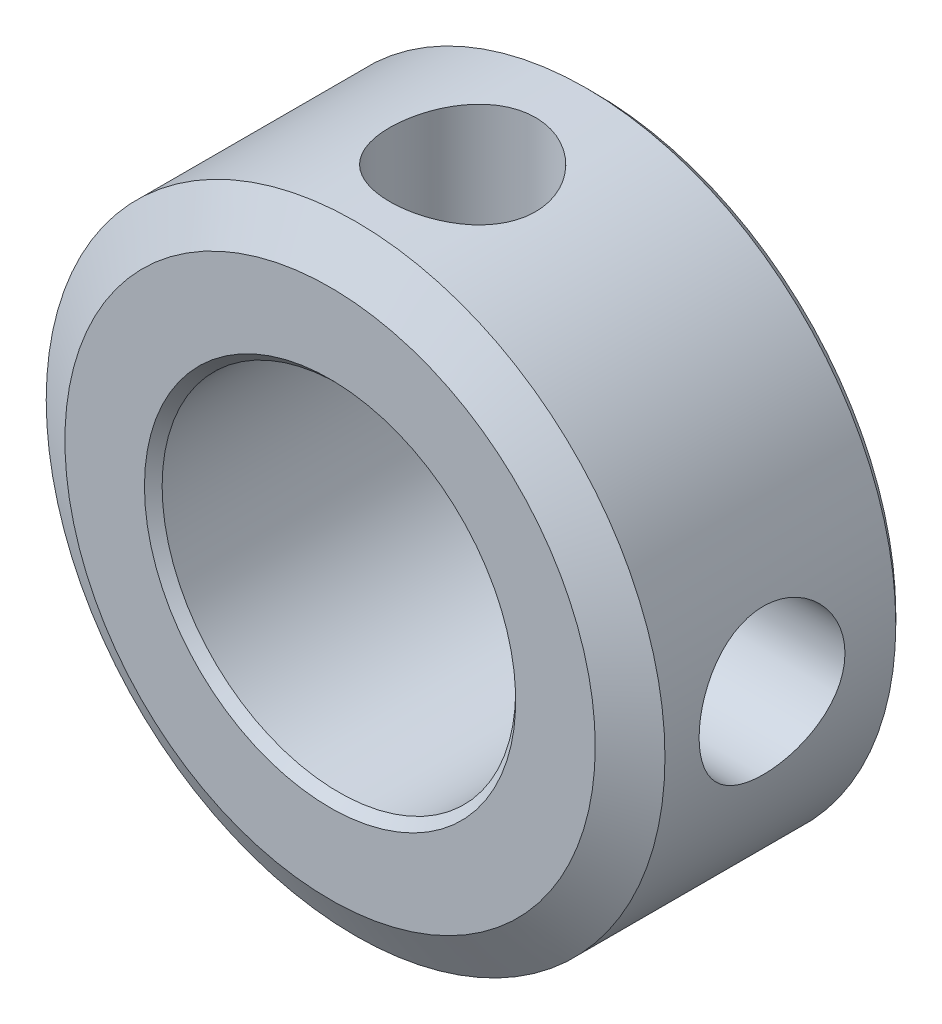
ISO-10303-21;
HEADER;
FILE_DESCRIPTION(('STEP AP214'),'2;1');
FILE_NAME('part.step','',(''),(''),'','','');
FILE_SCHEMA(('AUTOMOTIVE_DESIGN { 1 0 10303 214 1 1 1 1 }'));
ENDSEC;
DATA;
#1=APPLICATION_CONTEXT('core data for automotive mechanical design processes');
#2=APPLICATION_PROTOCOL_DEFINITION('international standard','automotive_design',2000,#1);
#3=PRODUCT_CONTEXT('',#1,'mechanical');
#4=PRODUCT('Part','Part','',(#3));
#5=PRODUCT_RELATED_PRODUCT_CATEGORY('part','',(#4));
#6=PRODUCT_DEFINITION_FORMATION('','',#4);
#7=PRODUCT_DEFINITION_CONTEXT('part definition',#1,'design');
#8=PRODUCT_DEFINITION('design','',#6,#7);
#9=PRODUCT_DEFINITION_SHAPE('','',#8);
#10=(LENGTH_UNIT() NAMED_UNIT(*) SI_UNIT(.MILLI.,.METRE.));
#11=(NAMED_UNIT(*) PLANE_ANGLE_UNIT() SI_UNIT($,.RADIAN.));
#12=(NAMED_UNIT(*) SI_UNIT($,.STERADIAN.) SOLID_ANGLE_UNIT());
#13=UNCERTAINTY_MEASURE_WITH_UNIT(LENGTH_MEASURE(1.E-05),#10,'distance_accuracy_value','');
#14=(GEOMETRIC_REPRESENTATION_CONTEXT(3) GLOBAL_UNCERTAINTY_ASSIGNED_CONTEXT((#13)) GLOBAL_UNIT_ASSIGNED_CONTEXT((#10,
#11,#12)) REPRESENTATION_CONTEXT('',''));
#15=CARTESIAN_POINT('',(0.,0.,0.));
#16=DIRECTION('',(0.,0.,1.));
#17=DIRECTION('',(1.,0.,0.));
#18=AXIS2_PLACEMENT_3D('',#15,#16,#17);
#19=CARTESIAN_POINT('',(0.,0.,0.));
#20=DIRECTION('',(0.,0.,1.));
#21=DIRECTION('',(1.,0.,0.));
#22=AXIS2_PLACEMENT_3D('',#19,#20,#21);
#23=CYLINDRICAL_SURFACE('',#22,7.);
#24=CARTESIAN_POINT('',(0.,7.,-1.35));
#25=CARTESIAN_POINT('',(-0.0913287393176134,6.99999836647252,-1.35000284387908));
#26=CARTESIAN_POINT('',(-0.182690417283303,6.99819467849873,-1.35760823084936));
#27=CARTESIAN_POINT('',(-0.362806323664361,6.9911739036526,-1.38778990146952));
#28=CARTESIAN_POINT('',(-0.451558855012934,6.98595464436713,-1.41037571327476));
#29=CARTESIAN_POINT('',(-0.623828476855957,6.97268218331077,-1.46976177401747));
#30=CARTESIAN_POINT('',(-0.707351348819676,6.96463217854926,-1.50654599200703));
#31=CARTESIAN_POINT('',(-0.867039208328408,6.9465609541058,-1.59323084871535));
#32=CARTESIAN_POINT('',(-0.943204151262114,6.93653972247338,-1.64313156695295));
#33=CARTESIAN_POINT('',(-1.0874214344422,6.91541181493805,-1.75560682165226));
#34=CARTESIAN_POINT('',(-1.15531854158778,6.90428991213628,-1.81837755355526));
#35=CARTESIAN_POINT('',(-1.27972508274131,6.88231817514457,-1.95439040917328));
#36=CARTESIAN_POINT('',(-1.33623336463363,6.87146836857753,-2.02763359102173));
#37=CARTESIAN_POINT('',(-1.43696684618771,6.85111743990827,-2.18369036745603));
#38=CARTESIAN_POINT('',(-1.48102236520305,6.84163573776828,-2.26661625042341));
#39=CARTESIAN_POINT('',(-1.5545098915109,6.8253150534534,-2.43895572170212));
#40=CARTESIAN_POINT('',(-1.58394395433771,6.81847569983819,-2.52836839605152));
#41=CARTESIAN_POINT('',(-1.62683125284546,6.80836995693017,-2.70944697203098));
#42=CARTESIAN_POINT('',(-1.64056162843084,6.80504168835829,-2.80104370422439));
#43=CARTESIAN_POINT('',(-1.65251435457551,6.80214944752779,-2.98529635366412));
#44=CARTESIAN_POINT('',(-1.65073893306961,6.80258493447765,-3.07795211683404));
#45=CARTESIAN_POINT('',(-1.63195247769315,6.80711518628286,-3.25959918079586));
#46=CARTESIAN_POINT('',(-1.61526770664355,6.81113158544196,-3.34862647996333));
#47=CARTESIAN_POINT('',(-1.56765494743684,6.82224669705885,-3.52258151951258));
#48=CARTESIAN_POINT('',(-1.53672604569693,6.82934560721949,-3.60750899655601));
#49=CARTESIAN_POINT('',(-1.46121486998613,6.84590028619908,-3.77174839705262));
#50=CARTESIAN_POINT('',(-1.41651088097455,6.85537691977426,-3.85100216939652));
#51=CARTESIAN_POINT('',(-1.31480384080152,6.87560701771075,-4.00100212094789));
#52=CARTESIAN_POINT('',(-1.25779885989579,6.88636068228985,-4.07174696258371));
#53=CARTESIAN_POINT('',(-1.13140044923306,6.90826612497408,-4.20459479769649));
#54=CARTESIAN_POINT('',(-1.06173067039408,6.91942110106382,-4.26643462795397));
#55=CARTESIAN_POINT('',(-0.912878848692461,6.940626418642,-4.37759964700094));
#56=CARTESIAN_POINT('',(-0.833696575268992,6.95067673334471,-4.42692453236693));
#57=CARTESIAN_POINT('',(-0.667717693598603,6.9685816950737,-4.51174102347949));
#58=CARTESIAN_POINT('',(-0.580900533100763,6.97643016161576,-4.54719379867907));
#59=CARTESIAN_POINT('',(-0.402313719817368,6.98900179511064,-4.60293155343658));
#60=CARTESIAN_POINT('',(-0.310544909289168,6.99372549177409,-4.62321910387752));
#61=CARTESIAN_POINT('',(-0.12691319889921,6.9994383716222,-4.64765768433283));
#62=CARTESIAN_POINT('',(-0.0351005767602219,7.00051059686152,-4.65216759669872));
#63=CARTESIAN_POINT('',(0.147966685501656,6.99903444009398,-4.64590172363087));
#64=CARTESIAN_POINT('',(0.239221369368363,6.99648634568227,-4.63512715238378));
#65=CARTESIAN_POINT('',(0.417362653019771,6.98810869992012,-4.59889492076259));
#66=CARTESIAN_POINT('',(0.504290552421104,6.98232213187254,-4.57362948647569));
#67=CARTESIAN_POINT('',(0.672672276070121,6.96811723407212,-4.50934934912358));
#68=CARTESIAN_POINT('',(0.754125584648711,6.9596986568229,-4.47033335300439));
#69=CARTESIAN_POINT('',(0.910700498955397,6.94096161251794,-4.37893957791364));
#70=CARTESIAN_POINT('',(0.985698570997652,6.93061465221504,-4.32635613942399));
#71=CARTESIAN_POINT('',(1.1259344495591,6.90921937825115,-4.20958668075749));
#72=CARTESIAN_POINT('',(1.19117076625592,6.89817095790026,-4.14539889283892));
#73=CARTESIAN_POINT('',(1.31148229591091,6.87632466673189,-4.00558494469405));
#74=CARTESIAN_POINT('',(1.36630717929423,6.865537385707,-3.92974138740337));
#75=CARTESIAN_POINT('',(1.46244648293613,6.84570445168464,-3.76971520767549));
#76=CARTESIAN_POINT('',(1.50376150719305,6.83665872083343,-3.68553295826358));
#77=CARTESIAN_POINT('',(1.57141076668764,6.82142736146697,-3.51167872553918));
#78=CARTESIAN_POINT('',(1.59783286852027,6.81522499881539,-3.42204247314157));
#79=CARTESIAN_POINT('',(1.63519178674544,6.80635903572141,-3.23943434416325));
#80=CARTESIAN_POINT('',(1.64613154940225,6.80369476199233,-3.14646310567877));
#81=CARTESIAN_POINT('',(1.65207449167986,6.80225382726605,-2.96235992416371));
#82=CARTESIAN_POINT('',(1.6474761616919,6.8033799546054,-2.87124138689862));
#83=CARTESIAN_POINT('',(1.62337546677893,6.80917049161347,-2.69111763633318));
#84=CARTESIAN_POINT('',(1.60387333967241,6.81383484482306,-2.60211238933462));
#85=CARTESIAN_POINT('',(1.55072477614989,6.82612522897376,-2.42911989393729));
#86=CARTESIAN_POINT('',(1.51714519678737,6.83373724790254,-2.34511104224849));
#87=CARTESIAN_POINT('',(1.43684939858625,6.85106877692285,-2.18386348852034));
#88=CARTESIAN_POINT('',(1.39013156490448,6.86078854604759,-2.10662562024476));
#89=CARTESIAN_POINT('',(1.28360204537891,6.88152384189012,-1.95916834829741));
#90=CARTESIAN_POINT('',(1.22351026298738,6.89256431174075,-1.88915476889469));
#91=CARTESIAN_POINT('',(1.09249493531384,6.91453965388042,-1.7600751611101));
#92=CARTESIAN_POINT('',(1.02156885982584,6.92547450086677,-1.70101169713411));
#93=CARTESIAN_POINT('',(0.869562734220028,6.9462096972569,-1.59461714467001));
#94=CARTESIAN_POINT('',(0.788341489140675,6.95598967744618,-1.54748354643594));
#95=CARTESIAN_POINT('',(0.618909771082385,6.97310375804727,-1.46761379042801));
#96=CARTESIAN_POINT('',(0.53070477860151,6.98043975328753,-1.43486647262321));
#97=CARTESIAN_POINT('',(0.368778884805455,6.99064750922865,-1.39002577949951));
#98=CARTESIAN_POINT('',(0.295881946838862,6.99413174237217,-1.37504670878436));
#99=CARTESIAN_POINT('',(0.14866389140863,6.99880858473134,-1.35503295613347));
#100=CARTESIAN_POINT('',(0.0743428585838595,7.00000132971399,-1.34999768504305));
#101=CARTESIAN_POINT('',(0.,7.,-1.35));
#102=B_SPLINE_CURVE_WITH_KNOTS('',3,(#24,#25,#26,#27,#28,#29,#30,#31,#32,#33,#34,#35,#36,#37,
#38,#39,#40,#41,#42,#43,#44,#45,#46,#47,#48,#49,#50,#51,#52,#53,#54,#55,#56,#57,#58,#59,#60,#61,
#62,#63,#64,#65,#66,#67,#68,#69,#70,#71,#72,#73,#74,#75,#76,#77,#78,#79,#80,#81,#82,#83,#84,#85,
#86,#87,#88,#89,#90,#91,#92,#93,#94,#95,#96,#97,#98,#99,#100,#101),.UNSPECIFIED.,.T.,.F.,(4,2,2,
2,2,2,2,2,2,2,2,2,2,2,2,2,2,2,2,2,2,2,2,2,2,2,2,2,2,2,2,2,2,2,2,2,2,2,4),(0.,0.273713930465044,
0.547602121208314,0.82118197421838,1.09476348584583,1.37287554367487,1.65101572175226,
1.93278083587447,2.21450632727553,2.49117922951627,2.76781237894395,3.0385362810522,
3.30927754913057,3.5824831951294,3.85573173204487,4.13587649000043,4.41602803938653,
4.69695826763982,4.97784086042084,5.25229133365971,5.52672000600246,5.79758981692428,
6.06848510628021,6.34375631656429,6.61906949551375,6.9003381998144,7.18159432744313,
7.46117322376554,7.74069890951611,8.01311084713954,8.28551843800228,8.5566467018989,
8.82780830516573,9.10529722607675,9.38285105021363,9.66473658497751,9.94640306170603,
10.1692231938147,10.3920301237804),.UNSPECIFIED.);
#103=CARTESIAN_POINT('',(0.,7.,-1.35));
#104=VERTEX_POINT('',#103);
#105=EDGE_CURVE('E60',#104,#104,#102,.T.);
#106=ORIENTED_EDGE('',*,*,#105,.T.);
#107=EDGE_LOOP('',(#106));
#108=FACE_BOUND('',#107,.T.);
#109=CARTESIAN_POINT('',(7.,0.,-1.35));
#110=CARTESIAN_POINT('',(6.99999836647252,0.091328739317589,-1.35000284387908));
#111=CARTESIAN_POINT('',(6.99819467849873,0.182690417283279,-1.35760823084936));
#112=CARTESIAN_POINT('',(6.9911739036526,0.362806323664337,-1.38778990146952));
#113=CARTESIAN_POINT('',(6.98595464436713,0.45155885501291,-1.41037571327476));
#114=CARTESIAN_POINT('',(6.97268218331077,0.623828476855933,-1.46976177401747));
#115=CARTESIAN_POINT('',(6.96463217854926,0.707351348819651,-1.50654599200703));
#116=CARTESIAN_POINT('',(6.9465609541058,0.867039208328383,-1.59323084871535));
#117=CARTESIAN_POINT('',(6.93653972247338,0.943204151262089,-1.64313156695295));
#118=CARTESIAN_POINT('',(6.91541181493805,1.08742143444218,-1.75560682165226));
#119=CARTESIAN_POINT('',(6.90428991213628,1.15531854158776,-1.81837755355526));
#120=CARTESIAN_POINT('',(6.88231817514458,1.27972508274128,-1.95439040917328));
#121=CARTESIAN_POINT('',(6.87146836857753,1.3362333646336,-2.02763359102173));
#122=CARTESIAN_POINT('',(6.85111743990828,1.43696684618768,-2.18369036745603));
#123=CARTESIAN_POINT('',(6.84163573776829,1.48102236520302,-2.26661625042341));
#124=CARTESIAN_POINT('',(6.82531505345341,1.55450989151088,-2.43895572170212));
#125=CARTESIAN_POINT('',(6.81847569983819,1.58394395433769,-2.52836839605151));
#126=CARTESIAN_POINT('',(6.80836995693017,1.62683125284543,-2.70944697203098));
#127=CARTESIAN_POINT('',(6.80504168835829,1.64056162843082,-2.80104370422439));
#128=CARTESIAN_POINT('',(6.80214944752779,1.65251435457548,-2.98529635366412));
#129=CARTESIAN_POINT('',(6.80258493447766,1.65073893306959,-3.07795211683404));
#130=CARTESIAN_POINT('',(6.80711518628287,1.63195247769312,-3.25959918079586));
#131=CARTESIAN_POINT('',(6.81113158544197,1.61526770664353,-3.34862647996333));
#132=CARTESIAN_POINT('',(6.82224669705886,1.56765494743681,-3.52258151951258));
#133=CARTESIAN_POINT('',(6.82934560721949,1.5367260456969,-3.60750899655601));
#134=CARTESIAN_POINT('',(6.84590028619908,1.46121486998611,-3.77174839705262));
#135=CARTESIAN_POINT('',(6.85537691977427,1.41651088097453,-3.85100216939652));
#136=CARTESIAN_POINT('',(6.87560701771075,1.3148038408015,-4.00100212094789));
#137=CARTESIAN_POINT('',(6.88636068228985,1.25779885989576,-4.0717469625837));
#138=CARTESIAN_POINT('',(6.90826612497409,1.13140044923303,-4.20459479769649));
#139=CARTESIAN_POINT('',(6.91942110106382,1.06173067039405,-4.26643462795397));
#140=CARTESIAN_POINT('',(6.940626418642,0.912878848692437,-4.37759964700094));
#141=CARTESIAN_POINT('',(6.95067673334471,0.833696575268967,-4.42692453236693));
#142=CARTESIAN_POINT('',(6.9685816950737,0.667717693598578,-4.51174102347949));
#143=CARTESIAN_POINT('',(6.97643016161576,0.580900533100739,-4.54719379867907));
#144=CARTESIAN_POINT('',(6.98900179511064,0.402313719817343,-4.60293155343658));
#145=CARTESIAN_POINT('',(6.99372549177409,0.310544909289144,-4.62321910387752));
#146=CARTESIAN_POINT('',(6.9994383716222,0.126913198899185,-4.64765768433283));
#147=CARTESIAN_POINT('',(7.00051059686152,0.0351005767601975,-4.65216759669872));
#148=CARTESIAN_POINT('',(6.99903444009398,-0.14796668550168,-4.64590172363087));
#149=CARTESIAN_POINT('',(6.99648634568227,-0.239221369368388,-4.63512715238378));
#150=CARTESIAN_POINT('',(6.98810869992012,-0.417362653019795,-4.59889492076259));
#151=CARTESIAN_POINT('',(6.98232213187253,-0.504290552421129,-4.57362948647569));
#152=CARTESIAN_POINT('',(6.96811723407212,-0.672672276070145,-4.50934934912358));
#153=CARTESIAN_POINT('',(6.9596986568229,-0.754125584648736,-4.47033335300439));
#154=CARTESIAN_POINT('',(6.94096161251794,-0.910700498955421,-4.37893957791364));
#155=CARTESIAN_POINT('',(6.93061465221504,-0.985698570997677,-4.32635613942399));
#156=CARTESIAN_POINT('',(6.90921937825115,-1.12593444955912,-4.20958668075749));
#157=CARTESIAN_POINT('',(6.89817095790026,-1.19117076625594,-4.14539889283892));
#158=CARTESIAN_POINT('',(6.87632466673188,-1.31148229591094,-4.00558494469405));
#159=CARTESIAN_POINT('',(6.865537385707,-1.36630717929425,-3.92974138740337));
#160=CARTESIAN_POINT('',(6.84570445168463,-1.46244648293615,-3.76971520767549));
#161=CARTESIAN_POINT('',(6.83665872083342,-1.50376150719307,-3.68553295826358));
#162=CARTESIAN_POINT('',(6.82142736146697,-1.57141076668766,-3.51167872553918));
#163=CARTESIAN_POINT('',(6.81522499881539,-1.59783286852029,-3.42204247314157));
#164=CARTESIAN_POINT('',(6.80635903572141,-1.63519178674546,-3.23943434416325));
#165=CARTESIAN_POINT('',(6.80369476199233,-1.64613154940227,-3.14646310567877));
#166=CARTESIAN_POINT('',(6.80225382726605,-1.65207449167989,-2.96235992416371));
#167=CARTESIAN_POINT('',(6.80337995460539,-1.64747616169192,-2.87124138689862));
#168=CARTESIAN_POINT('',(6.80917049161347,-1.62337546677896,-2.69111763633318));
#169=CARTESIAN_POINT('',(6.81383484482305,-1.60387333967243,-2.60211238933462));
#170=CARTESIAN_POINT('',(6.82612522897375,-1.55072477614991,-2.42911989393729));
#171=CARTESIAN_POINT('',(6.83373724790253,-1.5171451967874,-2.34511104224849));
#172=CARTESIAN_POINT('',(6.85106877692285,-1.43684939858627,-2.18386348852034));
#173=CARTESIAN_POINT('',(6.86078854604759,-1.3901315649045,-2.10662562024476));
#174=CARTESIAN_POINT('',(6.88152384189012,-1.28360204537894,-1.95916834829741));
#175=CARTESIAN_POINT('',(6.89256431174074,-1.2235102629874,-1.88915476889469));
#176=CARTESIAN_POINT('',(6.91453965388042,-1.09249493531386,-1.7600751611101));
#177=CARTESIAN_POINT('',(6.92547450086676,-1.02156885982587,-1.70101169713411));
#178=CARTESIAN_POINT('',(6.94620969725689,-0.869562734220052,-1.59461714467001));
#179=CARTESIAN_POINT('',(6.95598967744618,-0.788341489140699,-1.54748354643594));
#180=CARTESIAN_POINT('',(6.97310375804726,-0.61890977108241,-1.46761379042801));
#181=CARTESIAN_POINT('',(6.98043975328753,-0.530704778601535,-1.43486647262321));
#182=CARTESIAN_POINT('',(6.99064750922865,-0.36877888480548,-1.39002577949951));
#183=CARTESIAN_POINT('',(6.99413174237217,-0.295881946838886,-1.37504670878436));
#184=CARTESIAN_POINT('',(6.99880858473134,-0.148663891408655,-1.35503295613347));
#185=CARTESIAN_POINT('',(7.00000132971399,-0.0743428585838839,-1.34999768504305));
#186=CARTESIAN_POINT('',(7.,0.,-1.35));
#187=B_SPLINE_CURVE_WITH_KNOTS('',3,(#109,#110,#111,#112,#113,#114,#115,#116,#117,#118,#119,
#120,#121,#122,#123,#124,#125,#126,#127,#128,#129,#130,#131,#132,#133,#134,#135,#136,#137,#138,
#139,#140,#141,#142,#143,#144,#145,#146,#147,#148,#149,#150,#151,#152,#153,#154,#155,#156,#157,
#158,#159,#160,#161,#162,#163,#164,#165,#166,#167,#168,#169,#170,#171,#172,#173,#174,#175,#176,
#177,#178,#179,#180,#181,#182,#183,#184,#185,#186),.UNSPECIFIED.,.T.,.F.,(4,2,2,2,2,2,2,2,2,2,2,
2,2,2,2,2,2,2,2,2,2,2,2,2,2,2,2,2,2,2,2,2,2,2,2,2,2,2,4),(0.,0.273713930465044,
0.547602121208314,0.82118197421838,1.09476348584582,1.37287554367487,1.65101572175226,
1.93278083587447,2.21450632727553,2.49117922951627,2.76781237894395,3.0385362810522,
3.30927754913057,3.5824831951294,3.85573173204487,4.13587649000043,4.41602803938653,
4.69695826763982,4.97784086042084,5.25229133365971,5.52672000600246,5.79758981692428,
6.06848510628021,6.34375631656429,6.61906949551375,6.9003381998144,7.18159432744313,
7.46117322376554,7.74069890951611,8.01311084713954,8.28551843800228,8.5566467018989,
8.82780830516573,9.10529722607675,9.38285105021363,9.66473658497751,9.94640306170603,
10.1692231938147,10.3920301237804),.UNSPECIFIED.);
#188=CARTESIAN_POINT('',(7.,0.,-1.35));
#189=VERTEX_POINT('',#188);
#190=EDGE_CURVE('E117',#189,#189,#187,.T.);
#191=ORIENTED_EDGE('',*,*,#190,.T.);
#192=EDGE_LOOP('',(#191));
#193=FACE_BOUND('',#192,.T.);
#194=CARTESIAN_POINT('',(0.,0.,-5.8));
#195=DIRECTION('',(0.,0.,1.));
#196=DIRECTION('',(1.,0.,0.));
#197=AXIS2_PLACEMENT_3D('',#194,#195,#196);
#198=CIRCLE('',#197,7.);
#199=CARTESIAN_POINT('',(7.,0.,-5.8));
#200=VERTEX_POINT('',#199);
#201=EDGE_CURVE('E11',#200,#200,#198,.T.);
#202=ORIENTED_EDGE('',*,*,#201,.T.);
#203=EDGE_LOOP('',(#202));
#204=FACE_BOUND('',#203,.T.);
#205=CARTESIAN_POINT('',(0.,0.,-0.577350269189637));
#206=DIRECTION('',(0.,0.,1.));
#207=DIRECTION('',(1.,0.,0.));
#208=AXIS2_PLACEMENT_3D('',#205,#206,#207);
#209=CIRCLE('',#208,7.);
#210=CARTESIAN_POINT('',(7.,0.,-0.577350269189637));
#211=VERTEX_POINT('',#210);
#212=EDGE_CURVE('E106',#211,#211,#209,.T.);
#213=ORIENTED_EDGE('',*,*,#212,.F.);
#214=EDGE_LOOP('',(#213));
#215=FACE_BOUND('',#214,.T.);
#216=ADVANCED_FACE('F34',(#108,#193,#204,#215),#23,.T.);
#217=CARTESIAN_POINT('',(0.,4.,0.));
#218=DIRECTION('',(0.,0.,-1.));
#219=DIRECTION('',(-1.,0.,0.));
#220=AXIS2_PLACEMENT_3D('',#217,#218,#219);
#221=PLANE('',#220);
#222=CARTESIAN_POINT('',(0.,0.,0.));
#223=DIRECTION('',(0.,0.,-1.));
#224=DIRECTION('',(-1.,0.,0.));
#225=AXIS2_PLACEMENT_3D('',#222,#223,#224);
#226=CIRCLE('',#225,4.2);
#227=CARTESIAN_POINT('',(-4.2,0.,0.));
#228=VERTEX_POINT('',#227);
#229=EDGE_CURVE('E49',#228,#228,#226,.T.);
#230=ORIENTED_EDGE('',*,*,#229,.T.);
#231=EDGE_LOOP('',(#230));
#232=FACE_BOUND('',#231,.T.);
#233=CARTESIAN_POINT('',(0.,0.,0.));
#234=DIRECTION('',(0.,0.,1.));
#235=DIRECTION('',(1.,0.,0.));
#236=AXIS2_PLACEMENT_3D('',#233,#234,#235);
#237=CIRCLE('',#236,6.);
#238=CARTESIAN_POINT('',(6.,0.,0.));
#239=VERTEX_POINT('',#238);
#240=EDGE_CURVE('E104',#239,#239,#237,.T.);
#241=ORIENTED_EDGE('',*,*,#240,.T.);
#242=EDGE_LOOP('',(#241));
#243=FACE_BOUND('',#242,.T.);
#244=ADVANCED_FACE('F92',(#232,#243),#221,.F.);
#245=CARTESIAN_POINT('',(0.,7.,-6.));
#246=DIRECTION('',(0.,0.,1.));
#247=DIRECTION('',(1.,0.,0.));
#248=AXIS2_PLACEMENT_3D('',#245,#246,#247);
#249=PLANE('',#248);
#250=CARTESIAN_POINT('',(0.,0.,-6.));
#251=DIRECTION('',(0.,0.,1.));
#252=DIRECTION('',(1.,0.,0.));
#253=AXIS2_PLACEMENT_3D('',#250,#251,#252);
#254=CIRCLE('',#253,4.2);
#255=CARTESIAN_POINT('',(4.2,0.,-6.));
#256=VERTEX_POINT('',#255);
#257=EDGE_CURVE('E41',#256,#256,#254,.T.);
#258=ORIENTED_EDGE('',*,*,#257,.T.);
#259=EDGE_LOOP('',(#258));
#260=FACE_BOUND('',#259,.T.);
#261=CARTESIAN_POINT('',(0.,0.,-6.));
#262=DIRECTION('',(0.,0.,1.));
#263=DIRECTION('',(1.,0.,0.));
#264=AXIS2_PLACEMENT_3D('',#261,#262,#263);
#265=CIRCLE('',#264,6.8);
#266=CARTESIAN_POINT('',(6.8,0.,-6.));
#267=VERTEX_POINT('',#266);
#268=EDGE_CURVE('E45',#267,#267,#265,.F.);
#269=ORIENTED_EDGE('',*,*,#268,.T.);
#270=EDGE_LOOP('',(#269));
#271=FACE_BOUND('',#270,.T.);
#272=ADVANCED_FACE('F90',(#260,#271),#249,.F.);
#273=CARTESIAN_POINT('',(0.,0.,0.));
#274=DIRECTION('',(0.,0.,1.));
#275=DIRECTION('',(1.,0.,0.));
#276=AXIS2_PLACEMENT_3D('',#273,#274,#275);
#277=CYLINDRICAL_SURFACE('',#276,4.);
#278=CARTESIAN_POINT('',(0.,0.,-0.199999999999997));
#279=DIRECTION('',(0.,0.,-1.));
#280=DIRECTION('',(-1.,0.,0.));
#281=AXIS2_PLACEMENT_3D('',#278,#279,#280);
#282=CIRCLE('',#281,4.);
#283=CARTESIAN_POINT('',(-4.,0.,-0.199999999999997));
#284=VERTEX_POINT('',#283);
#285=EDGE_CURVE('E54',#284,#284,#282,.F.);
#286=ORIENTED_EDGE('',*,*,#285,.T.);
#287=EDGE_LOOP('',(#286));
#288=FACE_BOUND('',#287,.T.);
#289=CARTESIAN_POINT('',(0.,0.,-5.8));
#290=DIRECTION('',(0.,0.,1.));
#291=DIRECTION('',(1.,0.,0.));
#292=AXIS2_PLACEMENT_3D('',#289,#290,#291);
#293=CIRCLE('',#292,4.);
#294=CARTESIAN_POINT('',(4.,0.,-5.8));
#295=VERTEX_POINT('',#294);
#296=EDGE_CURVE('E57',#295,#295,#293,.F.);
#297=ORIENTED_EDGE('',*,*,#296,.T.);
#298=EDGE_LOOP('',(#297));
#299=FACE_BOUND('',#298,.T.);
#300=CARTESIAN_POINT('',(4.,0.,-1.35));
#301=CARTESIAN_POINT('',(3.99999309817074,-0.0884596783632928,-1.35000921720663));
#302=CARTESIAN_POINT('',(3.99703145792172,-0.177062252057596,-1.35715601434332));
#303=CARTESIAN_POINT('',(3.9854711320255,-0.351759669836423,-1.3854911419369));
#304=CARTESIAN_POINT('',(3.97685757767606,-0.437847271996974,-1.40671651102432));
#305=CARTESIAN_POINT('',(3.95491965529935,-0.604702496902755,-1.46229481220189));
#306=CARTESIAN_POINT('',(3.94161112398211,-0.68548693449121,-1.49660364335346));
#307=CARTESIAN_POINT('',(3.91158286286531,-0.840076633223501,-1.57719475784943));
#308=CARTESIAN_POINT('',(3.89486420463244,-0.91388407611758,-1.62347328117016));
#309=CARTESIAN_POINT('',(3.85876900012148,-1.05618769598527,-1.72910675464405));
#310=CARTESIAN_POINT('',(3.83930654387258,-1.12429373957477,-1.78895767024897));
#311=CARTESIAN_POINT('',(3.80029483347098,-1.24983574384758,-1.91898883965897));
#312=CARTESIAN_POINT('',(3.78074553976622,-1.30726618926958,-1.98917439921181));
#313=CARTESIAN_POINT('',(3.74272551686066,-1.41254826809051,-2.14196824887171));
#314=CARTESIAN_POINT('',(3.72435159658092,-1.45980781790563,-2.22501111530652));
#315=CARTESIAN_POINT('',(3.69212136090386,-1.53951358199408,-2.39873630929018));
#316=CARTESIAN_POINT('',(3.67826276509114,-1.57196727712792,-2.48941475136301));
#317=CARTESIAN_POINT('',(3.65756021871622,-1.61953738222493,-2.67134799700183));
#318=CARTESIAN_POINT('',(3.65041449103236,-1.63540371417155,-2.76237107214307));
#319=CARTESIAN_POINT('',(3.64307714795702,-1.65168918120804,-2.94604650736528));
#320=CARTESIAN_POINT('',(3.64288180572737,-1.65211659474002,-3.0386979676293));
#321=CARTESIAN_POINT('',(3.64921138579604,-1.63807780779832,-3.21559888661872));
#322=CARTESIAN_POINT('',(3.6552343974104,-1.6247239848746,-3.29995815874916));
#323=CARTESIAN_POINT('',(3.67247532251836,-1.58536484231199,-3.46511028438117));
#324=CARTESIAN_POINT('',(3.68369420783859,-1.55935715587186,-3.5459024676033));
#325=CARTESIAN_POINT('',(3.7103145848143,-1.4949241294249,-3.70364510875862));
#326=CARTESIAN_POINT('',(3.72579923184191,-1.45624866973018,-3.78047873780833));
#327=CARTESIAN_POINT('',(3.75918616236906,-1.36775445443626,-3.92686023246004));
#328=CARTESIAN_POINT('',(3.77708938726885,-1.3179313547816,-3.99640524224915));
#329=CARTESIAN_POINT('',(3.81509742396094,-1.2037191192487,-4.13228640778782));
#330=CARTESIAN_POINT('',(3.83526188253689,-1.1384663009439,-4.19788195770326));
#331=CARTESIAN_POINT('',(3.87426910607353,-0.997682554866229,-4.31744467444138));
#332=CARTESIAN_POINT('',(3.89311157289529,-0.922149319847448,-4.37140922386084));
#333=CARTESIAN_POINT('',(3.92787932271737,-0.760736369737339,-4.46723477358504));
#334=CARTESIAN_POINT('',(3.94373050716791,-0.674664094072251,-4.50880028319418));
#335=CARTESIAN_POINT('',(3.97016319816605,-0.495928253552991,-4.57660302410888));
#336=CARTESIAN_POINT('',(3.98074755693754,-0.4032682873724,-4.60284855321117));
#337=CARTESIAN_POINT('',(3.99492450637935,-0.220181304317688,-4.63772950367822));
#338=CARTESIAN_POINT('',(3.99891121146315,-0.129974172308237,-4.64735917793594));
#339=CARTESIAN_POINT('',(4.00069746426785,0.0508474401522074,-4.6516920437633));
#340=CARTESIAN_POINT('',(3.99849874371343,0.141461799500552,-4.64639941310822));
#341=CARTESIAN_POINT('',(3.98841747083847,0.315907755487534,-4.62175473175705));
#342=CARTESIAN_POINT('',(3.9808153168881,0.399855317526671,-4.60309592665991));
#343=CARTESIAN_POINT('',(3.96098887803091,0.563340473329561,-4.55320790366289));
#344=CARTESIAN_POINT('',(3.94876400644332,0.642877505872132,-4.52197709018521));
#345=CARTESIAN_POINT('',(3.92039728883464,0.798061975964461,-4.44681062001911));
#346=CARTESIAN_POINT('',(3.90414585630856,0.873512656660493,-4.40251143824379));
#347=CARTESIAN_POINT('',(3.86946768187549,1.01617847320906,-4.30286606574214));
#348=CARTESIAN_POINT('',(3.85104004134399,1.08339018342109,-4.24751530491017));
#349=CARTESIAN_POINT('',(3.8124029584454,1.2126199429274,-4.12279569518803));
#350=CARTESIAN_POINT('',(3.79215916493833,1.27394364561821,-4.0527161759607));
#351=CARTESIAN_POINT('',(3.75333928940831,1.38414835482504,-3.90292870939148));
#352=CARTESIAN_POINT('',(3.73476355904109,1.43302674162726,-3.82321874005745));
#353=CARTESIAN_POINT('',(3.70128700339843,1.51742282291386,-3.65490462946669));
#354=CARTESIAN_POINT('',(3.68643724424496,1.55275802936533,-3.56619808399195));
#355=CARTESIAN_POINT('',(3.66281640168182,1.60769618165392,-3.38329083402176));
#356=CARTESIAN_POINT('',(3.65404044124936,1.62731175174752,-3.28909460358183));
#357=CARTESIAN_POINT('',(3.6442955936524,1.64901123940267,-3.10556972684194));
#358=CARTESIAN_POINT('',(3.64278573581524,1.65231049364124,-3.01641278054206));
#359=CARTESIAN_POINT('',(3.64631178238904,1.64451485356566,-2.83887152924082));
#360=CARTESIAN_POINT('',(3.65134672892697,1.63342206561729,-2.75048711308063));
#361=CARTESIAN_POINT('',(3.666904904187,1.59817118006571,-2.5810669287423));
#362=CARTESIAN_POINT('',(3.67717261200251,1.57461958437453,-2.49987928857789));
#363=CARTESIAN_POINT('',(3.70184411206584,1.51570599472926,-2.34258547752592));
#364=CARTESIAN_POINT('',(3.71624906152171,1.48034069596892,-2.26648073570239));
#365=CARTESIAN_POINT('',(3.74863408895161,1.39638062253789,-2.1165779617586));
#366=CARTESIAN_POINT('',(3.76677577854003,1.3471244359927,-2.04318592897859));
#367=CARTESIAN_POINT('',(3.8041286463671,1.23771718137821,-1.90532831273572));
#368=CARTESIAN_POINT('',(3.82334018195057,1.17756245772961,-1.84086573722558));
#369=CARTESIAN_POINT('',(3.86230172013188,1.04300738755742,-1.71800586129633));
#370=CARTESIAN_POINT('',(3.88199359359226,0.967900110730166,-1.66036077639447));
#371=CARTESIAN_POINT('',(3.91832426905579,0.808343463182023,-1.55845984046128));
#372=CARTESIAN_POINT('',(3.9349616732268,0.723889843442839,-1.5142101136341));
#373=CARTESIAN_POINT('',(3.96305691394127,0.549414760109616,-1.44133626016526));
#374=CARTESIAN_POINT('',(3.97459855421812,0.459513381649414,-1.41245757464145));
#375=CARTESIAN_POINT('',(3.99154438775476,0.27571922921323,-1.37048891521486));
#376=CARTESIAN_POINT('',(3.99696786149576,0.181839966818018,-1.35734933375455));
#377=CARTESIAN_POINT('',(3.99968194626838,0.0584442952271836,-1.35077322966996));
#378=CARTESIAN_POINT('',(4.00000228058838,0.0292299486703246,-1.34999695433579));
#379=CARTESIAN_POINT('',(4.,0.,-1.35));
#380=B_SPLINE_CURVE_WITH_KNOTS('',3,(#300,#301,#302,#303,#304,#305,#306,#307,#308,#309,#310,
#311,#312,#313,#314,#315,#316,#317,#318,#319,#320,#321,#322,#323,#324,#325,#326,#327,#328,#329,
#330,#331,#332,#333,#334,#335,#336,#337,#338,#339,#340,#341,#342,#343,#344,#345,#346,#347,#348,
#349,#350,#351,#352,#353,#354,#355,#356,#357,#358,#359,#360,#361,#362,#363,#364,#365,#366,#367,
#368,#369,#370,#371,#372,#373,#374,#375,#376,#377,#378,#379),.UNSPECIFIED.,.T.,.F.,(4,2,2,2,2,2,
2,2,2,2,2,2,2,2,2,2,2,2,2,2,2,2,2,2,2,2,2,2,2,2,2,2,2,2,2,2,2,2,2,4),(0.,0.26529709877062,
0.53129493790666,0.796403981498881,1.06142984766523,1.33841878994456,1.61555043582129,
1.90598404924538,2.19627075414925,2.47277648539421,2.7491339503796,3.00480633611683,
3.26052656166861,3.52163539301341,3.78284615202015,4.06565185095456,4.34852112528509,
4.63767392136376,4.92666995726768,5.19768149557686,5.46861716672806,5.72643264660554,
5.98428085748385,6.25011488704506,6.51605907418433,6.80064580250403,7.08529238632159,
7.37364985225782,7.66177550895676,7.92807823226725,8.19434198489785,8.4486977209856,
8.70312467109945,8.9726747998471,9.24231550885214,9.53104085816543,9.81989801073179,
10.1038095613048,10.3868238858899,10.4744866574818),.UNSPECIFIED.);
#381=CARTESIAN_POINT('',(4.,0.,-1.35));
#382=VERTEX_POINT('',#381);
#383=EDGE_CURVE('E109',#382,#382,#380,.T.);
#384=ORIENTED_EDGE('',*,*,#383,.T.);
#385=EDGE_LOOP('',(#384));
#386=FACE_BOUND('',#385,.T.);
#387=CARTESIAN_POINT('',(0.,4.,-1.35));
#388=CARTESIAN_POINT('',(0.0884596783632788,3.99999309817074,-1.35000921720663));
#389=CARTESIAN_POINT('',(0.177062252057582,3.99703145792172,-1.35715601434332));
#390=CARTESIAN_POINT('',(0.351759669836409,3.9854711320255,-1.3854911419369));
#391=CARTESIAN_POINT('',(0.437847271996961,3.97685757767606,-1.40671651102432));
#392=CARTESIAN_POINT('',(0.604702496902741,3.95491965529936,-1.46229481220189));
#393=CARTESIAN_POINT('',(0.685486934491196,3.94161112398211,-1.49660364335346));
#394=CARTESIAN_POINT('',(0.840076633223488,3.91158286286531,-1.57719475784943));
#395=CARTESIAN_POINT('',(0.913884076117566,3.89486420463244,-1.62347328117016));
#396=CARTESIAN_POINT('',(1.05618769598525,3.85876900012149,-1.72910675464405));
#397=CARTESIAN_POINT('',(1.12429373957476,3.83930654387258,-1.78895767024897));
#398=CARTESIAN_POINT('',(1.24983574384757,3.80029483347099,-1.91898883965897));
#399=CARTESIAN_POINT('',(1.30726618926957,3.78074553976622,-1.98917439921181));
#400=CARTESIAN_POINT('',(1.41254826809049,3.74272551686067,-2.14196824887171));
#401=CARTESIAN_POINT('',(1.45980781790561,3.72435159658093,-2.22501111530652));
#402=CARTESIAN_POINT('',(1.53951358199407,3.69212136090386,-2.39873630929018));
#403=CARTESIAN_POINT('',(1.57196727712791,3.67826276509115,-2.48941475136301));
#404=CARTESIAN_POINT('',(1.61953738222492,3.65756021871623,-2.67134799700183));
#405=CARTESIAN_POINT('',(1.63540371417154,3.65041449103236,-2.76237107214307));
#406=CARTESIAN_POINT('',(1.65168918120803,3.64307714795703,-2.94604650736528));
#407=CARTESIAN_POINT('',(1.65211659474,3.64288180572738,-3.0386979676293));
#408=CARTESIAN_POINT('',(1.6380778077983,3.64921138579604,-3.21559888661872));
#409=CARTESIAN_POINT('',(1.62472398487459,3.6552343974104,-3.29995815874916));
#410=CARTESIAN_POINT('',(1.58536484231198,3.67247532251837,-3.46511028438117));
#411=CARTESIAN_POINT('',(1.55935715587185,3.68369420783859,-3.5459024676033));
#412=CARTESIAN_POINT('',(1.49492412942489,3.71031458481431,-3.70364510875862));
#413=CARTESIAN_POINT('',(1.45624866973017,3.72579923184191,-3.78047873780833));
#414=CARTESIAN_POINT('',(1.36775445443624,3.75918616236907,-3.92686023246004));
#415=CARTESIAN_POINT('',(1.31793135478159,3.77708938726885,-3.99640524224915));
#416=CARTESIAN_POINT('',(1.20371911924869,3.81509742396095,-4.13228640778782));
#417=CARTESIAN_POINT('',(1.13846630094389,3.8352618825369,-4.19788195770326));
#418=CARTESIAN_POINT('',(0.997682554866216,3.87426910607353,-4.31744467444138));
#419=CARTESIAN_POINT('',(0.922149319847434,3.8931115728953,-4.37140922386084));
#420=CARTESIAN_POINT('',(0.760736369737325,3.92787932271737,-4.46723477358504));
#421=CARTESIAN_POINT('',(0.674664094072237,3.94373050716791,-4.50880028319418));
#422=CARTESIAN_POINT('',(0.495928253552977,3.97016319816605,-4.57660302410888));
#423=CARTESIAN_POINT('',(0.403268287372386,3.98074755693754,-4.60284855321117));
#424=CARTESIAN_POINT('',(0.220181304317674,3.99492450637935,-4.63772950367822));
#425=CARTESIAN_POINT('',(0.129974172308223,3.99891121146315,-4.64735917793594));
#426=CARTESIAN_POINT('',(-0.0508474401522214,4.00069746426785,-4.6516920437633));
#427=CARTESIAN_POINT('',(-0.141461799500566,3.99849874371343,-4.64639941310822));
#428=CARTESIAN_POINT('',(-0.315907755487548,3.98841747083847,-4.62175473175705));
#429=CARTESIAN_POINT('',(-0.399855317526685,3.9808153168881,-4.60309592665991));
#430=CARTESIAN_POINT('',(-0.563340473329575,3.96098887803091,-4.55320790366289));
#431=CARTESIAN_POINT('',(-0.642877505872146,3.94876400644332,-4.52197709018521));
#432=CARTESIAN_POINT('',(-0.798061975964475,3.92039728883464,-4.44681062001911));
#433=CARTESIAN_POINT('',(-0.873512656660507,3.90414585630856,-4.40251143824379));
#434=CARTESIAN_POINT('',(-1.01617847320907,3.86946768187548,-4.30286606574214));
#435=CARTESIAN_POINT('',(-1.0833901834211,3.85104004134398,-4.24751530491017));
#436=CARTESIAN_POINT('',(-1.21261994292741,3.8124029584454,-4.12279569518803));
#437=CARTESIAN_POINT('',(-1.27394364561822,3.79215916493832,-4.0527161759607));
#438=CARTESIAN_POINT('',(-1.38414835482505,3.7533392894083,-3.90292870939148));
#439=CARTESIAN_POINT('',(-1.43302674162727,3.73476355904109,-3.82321874005745));
#440=CARTESIAN_POINT('',(-1.51742282291388,3.70128700339843,-3.65490462946669));
#441=CARTESIAN_POINT('',(-1.55275802936534,3.68643724424496,-3.56619808399195));
#442=CARTESIAN_POINT('',(-1.60769618165394,3.66281640168181,-3.38329083402176));
#443=CARTESIAN_POINT('',(-1.62731175174753,3.65404044124936,-3.28909460358183));
#444=CARTESIAN_POINT('',(-1.64901123940268,3.64429559365239,-3.10556972684194));
#445=CARTESIAN_POINT('',(-1.65231049364125,3.64278573581523,-3.01641278054206));
#446=CARTESIAN_POINT('',(-1.64451485356567,3.64631178238903,-2.83887152924082));
#447=CARTESIAN_POINT('',(-1.6334220656173,3.65134672892696,-2.75048711308063));
#448=CARTESIAN_POINT('',(-1.59817118006572,3.666904904187,-2.5810669287423));
#449=CARTESIAN_POINT('',(-1.57461958437454,3.6771726120025,-2.49987928857789));
#450=CARTESIAN_POINT('',(-1.51570599472928,3.70184411206584,-2.34258547752592));
#451=CARTESIAN_POINT('',(-1.48034069596893,3.7162490615217,-2.26648073570239));
#452=CARTESIAN_POINT('',(-1.3963806225379,3.7486340889516,-2.1165779617586));
#453=CARTESIAN_POINT('',(-1.34712443599271,3.76677577854003,-2.04318592897859));
#454=CARTESIAN_POINT('',(-1.23771718137822,3.80412864636709,-1.90532831273572));
#455=CARTESIAN_POINT('',(-1.17756245772962,3.82334018195056,-1.84086573722558));
#456=CARTESIAN_POINT('',(-1.04300738755744,3.86230172013188,-1.71800586129633));
#457=CARTESIAN_POINT('',(-0.967900110730179,3.88199359359226,-1.66036077639447));
#458=CARTESIAN_POINT('',(-0.808343463182036,3.91832426905579,-1.55845984046128));
#459=CARTESIAN_POINT('',(-0.723889843442853,3.9349616732268,-1.5142101136341));
#460=CARTESIAN_POINT('',(-0.54941476010963,3.96305691394126,-1.44133626016526));
#461=CARTESIAN_POINT('',(-0.459513381649428,3.97459855421812,-1.41245757464145));
#462=CARTESIAN_POINT('',(-0.275719229213244,3.99154438775475,-1.37048891521486));
#463=CARTESIAN_POINT('',(-0.181839966818032,3.99696786149576,-1.35734933375455));
#464=CARTESIAN_POINT('',(-0.0584442952271975,3.99968194626838,-1.35077322966996));
#465=CARTESIAN_POINT('',(-0.0292299486703386,4.00000228058838,-1.34999695433579));
#466=CARTESIAN_POINT('',(0.,4.,-1.35));
#467=B_SPLINE_CURVE_WITH_KNOTS('',3,(#387,#388,#389,#390,#391,#392,#393,#394,#395,#396,#397,
#398,#399,#400,#401,#402,#403,#404,#405,#406,#407,#408,#409,#410,#411,#412,#413,#414,#415,#416,
#417,#418,#419,#420,#421,#422,#423,#424,#425,#426,#427,#428,#429,#430,#431,#432,#433,#434,#435,
#436,#437,#438,#439,#440,#441,#442,#443,#444,#445,#446,#447,#448,#449,#450,#451,#452,#453,#454,
#455,#456,#457,#458,#459,#460,#461,#462,#463,#464,#465,#466),.UNSPECIFIED.,.T.,.F.,(4,2,2,2,2,2,
2,2,2,2,2,2,2,2,2,2,2,2,2,2,2,2,2,2,2,2,2,2,2,2,2,2,2,2,2,2,2,2,2,4),(0.,0.26529709877062,
0.53129493790666,0.796403981498881,1.06142984766523,1.33841878994456,1.61555043582129,
1.90598404924538,2.19627075414925,2.47277648539421,2.7491339503796,3.00480633611683,
3.26052656166861,3.52163539301341,3.78284615202015,4.06565185095456,4.34852112528509,
4.63767392136376,4.92666995726768,5.19768149557686,5.46861716672806,5.72643264660554,
5.98428085748385,6.25011488704506,6.51605907418433,6.80064580250403,7.08529238632159,
7.37364985225782,7.66177550895676,7.92807823226725,8.19434198489785,8.4486977209856,
8.70312467109946,8.9726747998471,9.24231550885214,9.53104085816543,9.81989801073179,
10.1038095613048,10.3868238858899,10.4744866574818),.UNSPECIFIED.);
#468=CARTESIAN_POINT('',(0.,4.,-1.35));
#469=VERTEX_POINT('',#468);
#470=EDGE_CURVE('E68',#469,#469,#467,.T.);
#471=ORIENTED_EDGE('',*,*,#470,.T.);
#472=EDGE_LOOP('',(#471));
#473=FACE_BOUND('',#472,.T.);
#474=ADVANCED_FACE('F82',(#288,#299,#386,#473),#277,.F.);
#475=CARTESIAN_POINT('',(0.,7.,-3.));
#476=DIRECTION('',(0.,1.,0.));
#477=DIRECTION('',(0.,0.,1.));
#478=AXIS2_PLACEMENT_3D('',#475,#476,#477);
#479=CYLINDRICAL_SURFACE('',#478,1.65);
#480=ORIENTED_EDGE('',*,*,#470,.F.);
#481=EDGE_LOOP('',(#480));
#482=FACE_BOUND('',#481,.T.);
#483=ORIENTED_EDGE('',*,*,#105,.F.);
#484=EDGE_LOOP('',(#483));
#485=FACE_BOUND('',#484,.T.);
#486=ADVANCED_FACE('F77',(#482,#485),#479,.F.);
#487=CARTESIAN_POINT('',(7.,0.,-3.));
#488=DIRECTION('',(1.,0.,0.));
#489=DIRECTION('',(0.,0.,1.));
#490=AXIS2_PLACEMENT_3D('',#487,#488,#489);
#491=CYLINDRICAL_SURFACE('',#490,1.65);
#492=ORIENTED_EDGE('',*,*,#383,.F.);
#493=EDGE_LOOP('',(#492));
#494=FACE_BOUND('',#493,.T.);
#495=ORIENTED_EDGE('',*,*,#190,.F.);
#496=EDGE_LOOP('',(#495));
#497=FACE_BOUND('',#496,.T.);
#498=ADVANCED_FACE('F81',(#494,#497),#491,.F.);
#499=CARTESIAN_POINT('',(0.,0.,-0.199999999999997));
#500=DIRECTION('',(0.,0.,1.));
#501=DIRECTION('',(1.,0.,0.));
#502=AXIS2_PLACEMENT_3D('',#499,#500,#501);
#503=CONICAL_SURFACE('',#502,4.,0.785398163397444);
#504=ORIENTED_EDGE('',*,*,#229,.F.);
#505=EDGE_LOOP('',(#504));
#506=FACE_BOUND('',#505,.T.);
#507=ORIENTED_EDGE('',*,*,#285,.F.);
#508=EDGE_LOOP('',(#507));
#509=FACE_BOUND('',#508,.T.);
#510=ADVANCED_FACE('F125',(#506,#509),#503,.F.);
#511=CARTESIAN_POINT('',(0.,0.,-6.));
#512=DIRECTION('',(0.,0.,-1.));
#513=DIRECTION('',(-1.,0.,0.));
#514=AXIS2_PLACEMENT_3D('',#511,#512,#513);
#515=CONICAL_SURFACE('',#514,4.2,0.785398163397444);
#516=ORIENTED_EDGE('',*,*,#296,.F.);
#517=EDGE_LOOP('',(#516));
#518=FACE_BOUND('',#517,.T.);
#519=ORIENTED_EDGE('',*,*,#257,.F.);
#520=EDGE_LOOP('',(#519));
#521=FACE_BOUND('',#520,.T.);
#522=ADVANCED_FACE('F134',(#518,#521),#515,.F.);
#523=CARTESIAN_POINT('',(0.,0.,-5.8));
#524=DIRECTION('',(0.,0.,1.));
#525=DIRECTION('',(1.,0.,0.));
#526=AXIS2_PLACEMENT_3D('',#523,#524,#525);
#527=CONICAL_SURFACE('',#526,7.,0.78539816339745);
#528=ORIENTED_EDGE('',*,*,#268,.F.);
#529=EDGE_LOOP('',(#528));
#530=FACE_BOUND('',#529,.T.);
#531=ORIENTED_EDGE('',*,*,#201,.F.);
#532=EDGE_LOOP('',(#531));
#533=FACE_BOUND('',#532,.T.);
#534=ADVANCED_FACE('F36',(#530,#533),#527,.T.);
#535=CARTESIAN_POINT('',(0.,0.,0.));
#536=DIRECTION('',(0.,0.,-1.));
#537=DIRECTION('',(-1.,0.,0.));
#538=AXIS2_PLACEMENT_3D('',#535,#536,#537);
#539=CONICAL_SURFACE('',#538,6.,1.04719755119659);
#540=ORIENTED_EDGE('',*,*,#212,.T.);
#541=EDGE_LOOP('',(#540));
#542=FACE_BOUND('',#541,.T.);
#543=ORIENTED_EDGE('',*,*,#240,.F.);
#544=EDGE_LOOP('',(#543));
#545=FACE_BOUND('',#544,.T.);
#546=ADVANCED_FACE('F127',(#542,#545),#539,.T.);
#547=CLOSED_SHELL('',(#216,#244,#272,#474,#486,#498,#510,#522,#534,#546));
#548=MANIFOLD_SOLID_BREP('B2',#547);
#549=ADVANCED_BREP_SHAPE_REPRESENTATION('',(#18,#548),#14);
#550=SHAPE_DEFINITION_REPRESENTATION(#9,#549);
ENDSEC;
END-ISO-10303-21;
